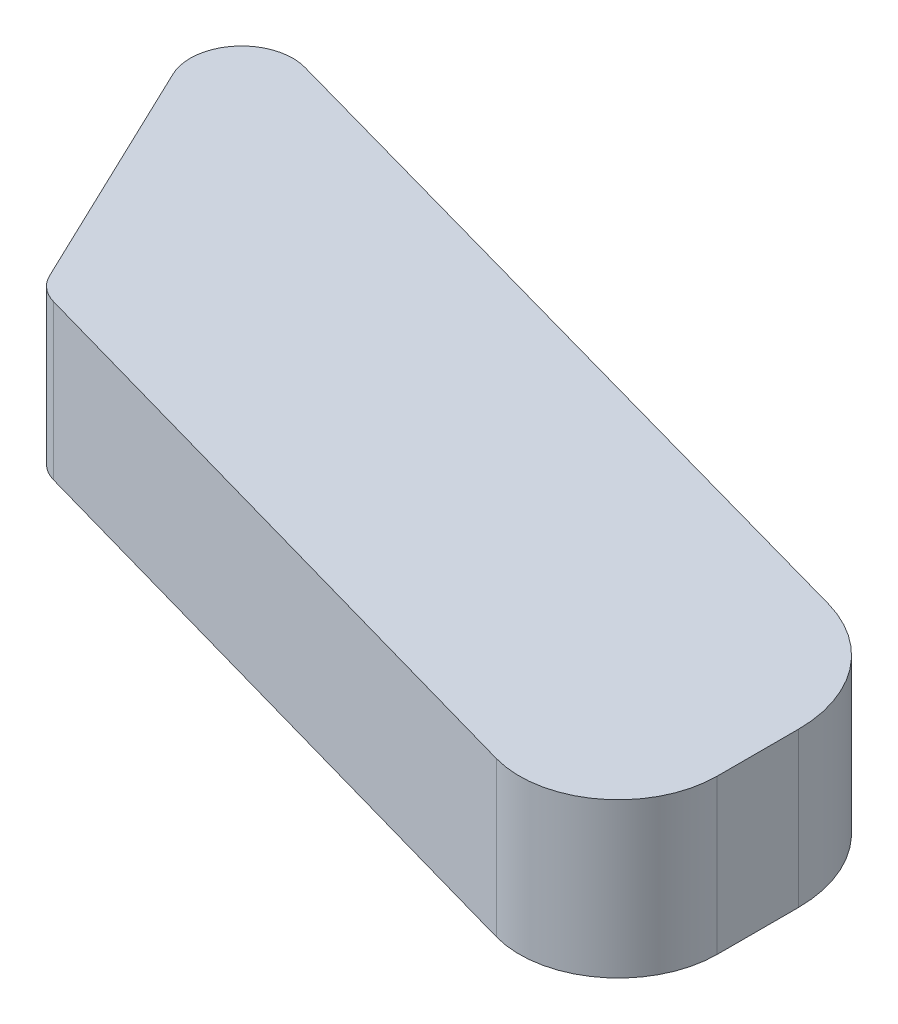
ISO-10303-21;
HEADER;
FILE_DESCRIPTION(('STEP AP214'),'2;1');
FILE_NAME('part.step','',(''),(''),'','','');
FILE_SCHEMA(('AUTOMOTIVE_DESIGN { 1 0 10303 214 1 1 1 1 }'));
ENDSEC;
DATA;
#1=APPLICATION_CONTEXT('core data for automotive mechanical design processes');
#2=APPLICATION_PROTOCOL_DEFINITION('international standard','automotive_design',2000,#1);
#3=PRODUCT_CONTEXT('',#1,'mechanical');
#4=PRODUCT('Part','Part','',(#3));
#5=PRODUCT_RELATED_PRODUCT_CATEGORY('part','',(#4));
#6=PRODUCT_DEFINITION_FORMATION('','',#4);
#7=PRODUCT_DEFINITION_CONTEXT('part definition',#1,'design');
#8=PRODUCT_DEFINITION('design','',#6,#7);
#9=PRODUCT_DEFINITION_SHAPE('','',#8);
#10=(LENGTH_UNIT() NAMED_UNIT(*) SI_UNIT(.MILLI.,.METRE.));
#11=(NAMED_UNIT(*) PLANE_ANGLE_UNIT() SI_UNIT($,.RADIAN.));
#12=(NAMED_UNIT(*) SI_UNIT($,.STERADIAN.) SOLID_ANGLE_UNIT());
#13=UNCERTAINTY_MEASURE_WITH_UNIT(LENGTH_MEASURE(1.E-05),#10,'distance_accuracy_value','');
#14=(GEOMETRIC_REPRESENTATION_CONTEXT(3) GLOBAL_UNCERTAINTY_ASSIGNED_CONTEXT((#13)) GLOBAL_UNIT_ASSIGNED_CONTEXT((#10,
#11,#12)) REPRESENTATION_CONTEXT('',''));
#15=CARTESIAN_POINT('',(0.,0.,0.));
#16=DIRECTION('',(0.,0.,1.));
#17=DIRECTION('',(1.,0.,0.));
#18=AXIS2_PLACEMENT_3D('',#15,#16,#17);
#19=CARTESIAN_POINT('',(0.151021595103856,2.9956,2.9686260486294));
#20=DIRECTION('',(0.,-1.,0.));
#21=DIRECTION('',(-1.,0.,0.));
#22=AXIS2_PLACEMENT_3D('',#19,#20,#21);
#23=CYLINDRICAL_SURFACE('',#22,0.0216216216215917);
#24=CARTESIAN_POINT('',(0.151021595103856,2.9956,2.9686260486294));
#25=DIRECTION('',(0.,1.,0.));
#26=DIRECTION('',(1.,0.,0.));
#27=AXIS2_PLACEMENT_3D('',#24,#25,#26);
#28=CIRCLE('',#27,0.0216216216215917);
#29=CARTESIAN_POINT('',(0.129399973482265,2.9956,2.9686260486294));
#30=VERTEX_POINT('',#29);
#31=CARTESIAN_POINT('',(0.131512238873626,2.9956,2.9779469681671));
#32=VERTEX_POINT('',#31);
#33=EDGE_CURVE('E11',#30,#32,#28,.T.);
#34=ORIENTED_EDGE('',*,*,#33,.F.);
#35=DIRECTION('',(0.,-1.,0.));
#36=VECTOR('',#35,1.);
#37=CARTESIAN_POINT('',(0.129399973482265,2.9956,2.9686260486294));
#38=LINE('',#37,#36);
#39=CARTESIAN_POINT('',(0.129399973482265,2.9306,2.9686260486294));
#40=VERTEX_POINT('',#39);
#41=EDGE_CURVE('E24',#30,#40,#38,.T.);
#42=ORIENTED_EDGE('',*,*,#41,.T.);
#43=CARTESIAN_POINT('',(0.151021595103856,2.9306,2.9686260486294));
#44=DIRECTION('',(0.,1.,0.));
#45=DIRECTION('',(1.,0.,0.));
#46=AXIS2_PLACEMENT_3D('',#43,#44,#45);
#47=CIRCLE('',#46,0.0216216216215917);
#48=CARTESIAN_POINT('',(0.131512238873626,2.9306,2.9779469681671));
#49=VERTEX_POINT('',#48);
#50=EDGE_CURVE('E157',#40,#49,#47,.T.);
#51=ORIENTED_EDGE('',*,*,#50,.T.);
#52=DIRECTION('',(0.,-1.,0.));
#53=VECTOR('',#52,1.);
#54=CARTESIAN_POINT('',(0.131512238873626,2.9956,2.9779469681671));
#55=LINE('',#54,#53);
#56=EDGE_CURVE('E154',#32,#49,#55,.T.);
#57=ORIENTED_EDGE('',*,*,#56,.F.);
#58=EDGE_LOOP('',(#34,#42,#51,#57));
#59=FACE_BOUND('',#58,.T.);
#60=ADVANCED_FACE('F17',(#59),#23,.T.);
#61=CARTESIAN_POINT('',(0.460422838557316,2.9956,3.1194344723795));
#62=DIRECTION('',(0.,-1.,0.));
#63=DIRECTION('',(-1.,0.,0.));
#64=AXIS2_PLACEMENT_3D('',#61,#62,#63);
#65=CYLINDRICAL_SURFACE('',#64,0.041621621621607);
#66=CARTESIAN_POINT('',(0.460422838557316,2.9306,3.1194344723795));
#67=DIRECTION('',(0.,1.,0.));
#68=DIRECTION('',(1.,0.,0.));
#69=AXIS2_PLACEMENT_3D('',#66,#67,#68);
#70=CIRCLE('',#69,0.041621621621607);
#71=CARTESIAN_POINT('',(0.449110063696537,2.9306,3.1594891913445));
#72=VERTEX_POINT('',#71);
#73=CARTESIAN_POINT('',(0.502044460110766,2.9306,3.1194320904308));
#74=VERTEX_POINT('',#73);
#75=EDGE_CURVE('E152',#72,#74,#70,.T.);
#76=ORIENTED_EDGE('',*,*,#75,.T.);
#77=DIRECTION('',(0.,-1.,0.));
#78=VECTOR('',#77,1.);
#79=CARTESIAN_POINT('',(0.502044460110766,2.9956,3.1194320904308));
#80=LINE('',#79,#78);
#81=CARTESIAN_POINT('',(0.502044460110766,2.9956,3.1194320904308));
#82=VERTEX_POINT('',#81);
#83=EDGE_CURVE('E149',#82,#74,#80,.T.);
#84=ORIENTED_EDGE('',*,*,#83,.F.);
#85=CARTESIAN_POINT('',(0.460422838557316,2.9956,3.1194344723795));
#86=DIRECTION('',(0.,1.,0.));
#87=DIRECTION('',(1.,0.,0.));
#88=AXIS2_PLACEMENT_3D('',#85,#86,#87);
#89=CIRCLE('',#88,0.041621621621607);
#90=CARTESIAN_POINT('',(0.449110063696537,2.9956,3.1594891913445));
#91=VERTEX_POINT('',#90);
#92=EDGE_CURVE('E147',#91,#82,#89,.T.);
#93=ORIENTED_EDGE('',*,*,#92,.F.);
#94=DIRECTION('',(0.,-1.,0.));
#95=VECTOR('',#94,1.);
#96=CARTESIAN_POINT('',(0.449110063696537,2.9956,3.1594891913445));
#97=LINE('',#96,#95);
#98=EDGE_CURVE('E107',#91,#72,#97,.T.);
#99=ORIENTED_EDGE('',*,*,#98,.T.);
#100=EDGE_LOOP('',(#76,#84,#93,#99));
#101=FACE_BOUND('',#100,.T.);
#102=ADVANCED_FACE('F179',(#101),#65,.T.);
#103=CARTESIAN_POINT('',(0.502044460110766,2.9956,3.1194320904308));
#104=DIRECTION('',(-0.999999998362442,0.,5.72286373709856E-05));
#105=DIRECTION('',(5.72286373709856E-05,0.,0.999999998362442));
#106=AXIS2_PLACEMENT_3D('',#103,#104,#105);
#107=PLANE('',#106);
#108=DIRECTION('',(-5.72286373709856E-05,0.,-0.999999998362441));
#109=VECTOR('',#108,1.);
#110=CARTESIAN_POINT('',(0.502044460110766,2.9306,3.1194320904308));
#111=LINE('',#110,#109);
#112=CARTESIAN_POINT('',(0.502042503467266,2.9306,3.085242153597));
#113=VERTEX_POINT('',#112);
#114=EDGE_CURVE('E144',#74,#113,#111,.T.);
#115=ORIENTED_EDGE('',*,*,#114,.T.);
#116=DIRECTION('',(0.,-1.,0.));
#117=VECTOR('',#116,1.);
#118=CARTESIAN_POINT('',(0.502042503467266,2.9956,3.085242153597));
#119=LINE('',#118,#117);
#120=CARTESIAN_POINT('',(0.502042503467266,2.9956,3.085242153597));
#121=VERTEX_POINT('',#120);
#122=EDGE_CURVE('E141',#121,#113,#119,.T.);
#123=ORIENTED_EDGE('',*,*,#122,.F.);
#124=DIRECTION('',(-5.72286373709856E-05,0.,-0.999999998362441));
#125=VECTOR('',#124,1.);
#126=CARTESIAN_POINT('',(0.502044460110766,2.9956,3.1194320904308));
#127=LINE('',#126,#125);
#128=EDGE_CURVE('E138',#82,#121,#127,.T.);
#129=ORIENTED_EDGE('',*,*,#128,.F.);
#130=ORIENTED_EDGE('',*,*,#83,.T.);
#131=EDGE_LOOP('',(#115,#123,#129,#130));
#132=FACE_BOUND('',#131,.T.);
#133=ADVANCED_FACE('F177',(#132),#107,.F.);
#134=CARTESIAN_POINT('',(0.447988449501714,2.9956,3.085245247037));
#135=DIRECTION('',(0.,-1.,0.));
#136=DIRECTION('',(-1.,0.,0.));
#137=AXIS2_PLACEMENT_3D('',#134,#135,#136);
#138=CYLINDRICAL_SURFACE('',#137,0.0540540540540688);
#139=CARTESIAN_POINT('',(0.447988449501714,2.9306,3.085245247037));
#140=DIRECTION('',(0.,1.,0.));
#141=DIRECTION('',(1.,0.,0.));
#142=AXIS2_PLACEMENT_3D('',#139,#140,#141);
#143=CIRCLE('',#142,0.0540540540540688);
#144=CARTESIAN_POINT('',(0.462529665695283,2.9306,3.0331838045743));
#145=VERTEX_POINT('',#144);
#146=EDGE_CURVE('E136',#113,#145,#143,.T.);
#147=ORIENTED_EDGE('',*,*,#146,.T.);
#148=DIRECTION('',(0.,-1.,0.));
#149=VECTOR('',#148,1.);
#150=CARTESIAN_POINT('',(0.462529665695283,2.9956,3.0331838045743));
#151=LINE('',#150,#149);
#152=CARTESIAN_POINT('',(0.462529665695283,2.9956,3.0331838045743));
#153=VERTEX_POINT('',#152);
#154=EDGE_CURVE('E133',#153,#145,#151,.T.);
#155=ORIENTED_EDGE('',*,*,#154,.F.);
#156=CARTESIAN_POINT('',(0.447988449501714,2.9956,3.085245247037));
#157=DIRECTION('',(0.,1.,0.));
#158=DIRECTION('',(1.,0.,0.));
#159=AXIS2_PLACEMENT_3D('',#156,#157,#158);
#160=CIRCLE('',#159,0.0540540540540688);
#161=EDGE_CURVE('E130',#121,#153,#160,.T.);
#162=ORIENTED_EDGE('',*,*,#161,.F.);
#163=ORIENTED_EDGE('',*,*,#122,.T.);
#164=EDGE_LOOP('',(#147,#155,#162,#163));
#165=FACE_BOUND('',#164,.T.);
#166=ADVANCED_FACE('F173',(#165),#138,.T.);
#167=CARTESIAN_POINT('',(0.462529665695283,2.9956,3.0331838045743));
#168=DIRECTION('',(-0.26901249958118,0.,0.963136685558745));
#169=DIRECTION('',(0.963136685558745,0.,0.26901249958118));
#170=AXIS2_PLACEMENT_3D('',#167,#168,#169);
#171=PLANE('',#170);
#172=DIRECTION('',(-0.963136685558745,0.,-0.26901249958118));
#173=VECTOR('',#172,1.);
#174=CARTESIAN_POINT('',(0.462529665695283,2.9306,3.0331838045743));
#175=LINE('',#174,#173);
#176=CARTESIAN_POINT('',(0.156838081581269,2.9306,2.9478014716443));
#177=VERTEX_POINT('',#176);
#178=EDGE_CURVE('E128',#145,#177,#175,.T.);
#179=ORIENTED_EDGE('',*,*,#178,.T.);
#180=DIRECTION('',(0.,-1.,0.));
#181=VECTOR('',#180,1.);
#182=CARTESIAN_POINT('',(0.156838081581269,2.9956,2.9478014716443));
#183=LINE('',#182,#181);
#184=CARTESIAN_POINT('',(0.156838081581269,2.9956,2.9478014716443));
#185=VERTEX_POINT('',#184);
#186=EDGE_CURVE('E125',#185,#177,#183,.T.);
#187=ORIENTED_EDGE('',*,*,#186,.F.);
#188=DIRECTION('',(-0.963136685558745,0.,-0.26901249958118));
#189=VECTOR('',#188,1.);
#190=CARTESIAN_POINT('',(0.462529665695283,2.9956,3.0331838045743));
#191=LINE('',#190,#189);
#192=EDGE_CURVE('E122',#153,#185,#191,.T.);
#193=ORIENTED_EDGE('',*,*,#192,.F.);
#194=ORIENTED_EDGE('',*,*,#154,.T.);
#195=EDGE_LOOP('',(#179,#187,#193,#194));
#196=FACE_BOUND('',#195,.T.);
#197=ADVANCED_FACE('F169',(#196),#171,.F.);
#198=CARTESIAN_POINT('',(0.151021595103856,2.9956,2.9686260486294));
#199=DIRECTION('',(0.,-1.,0.));
#200=DIRECTION('',(-1.,0.,0.));
#201=AXIS2_PLACEMENT_3D('',#198,#199,#200);
#202=CYLINDRICAL_SURFACE('',#201,0.0216216216215917);
#203=ORIENTED_EDGE('',*,*,#41,.F.);
#204=CARTESIAN_POINT('',(0.151021595103856,2.9956,2.9686260486294));
#205=DIRECTION('',(0.,1.,0.));
#206=DIRECTION('',(1.,0.,0.));
#207=AXIS2_PLACEMENT_3D('',#204,#205,#206);
#208=CIRCLE('',#207,0.0216216216215917);
#209=EDGE_CURVE('E120',#185,#30,#208,.T.);
#210=ORIENTED_EDGE('',*,*,#209,.F.);
#211=ORIENTED_EDGE('',*,*,#186,.T.);
#212=CARTESIAN_POINT('',(0.151021595103856,2.9306,2.9686260486294));
#213=DIRECTION('',(0.,1.,0.));
#214=DIRECTION('',(1.,0.,0.));
#215=AXIS2_PLACEMENT_3D('',#212,#213,#214);
#216=CIRCLE('',#215,0.0216216216215917);
#217=EDGE_CURVE('E117',#177,#40,#216,.T.);
#218=ORIENTED_EDGE('',*,*,#217,.T.);
#219=EDGE_LOOP('',(#203,#210,#211,#218));
#220=FACE_BOUND('',#219,.T.);
#221=ADVANCED_FACE('F166',(#220),#202,.T.);
#222=CARTESIAN_POINT('',(0.131512238873626,2.9956,2.9779469681671));
#223=DIRECTION('',(0.902307725649961,0.,-0.431092528620475));
#224=DIRECTION('',(-0.431092528620475,0.,-0.902307725649961));
#225=AXIS2_PLACEMENT_3D('',#222,#223,#224);
#226=PLANE('',#225);
#227=DIRECTION('',(0.431092528620475,0.,0.902307725649961));
#228=VECTOR('',#227,1.);
#229=CARTESIAN_POINT('',(0.131512238873626,2.9306,2.9779469681671));
#230=LINE('',#229,#228);
#231=CARTESIAN_POINT('',(0.179072678177959,2.9306,3.0774943946951));
#232=VERTEX_POINT('',#231);
#233=EDGE_CURVE('E115',#49,#232,#230,.T.);
#234=ORIENTED_EDGE('',*,*,#233,.T.);
#235=DIRECTION('',(0.,-1.,0.));
#236=VECTOR('',#235,1.);
#237=CARTESIAN_POINT('',(0.179072678177959,2.9956,3.0774943946951));
#238=LINE('',#237,#236);
#239=CARTESIAN_POINT('',(0.179072678177959,2.9956,3.0774943946951));
#240=VERTEX_POINT('',#239);
#241=EDGE_CURVE('E113',#240,#232,#238,.T.);
#242=ORIENTED_EDGE('',*,*,#241,.F.);
#243=DIRECTION('',(0.431092528620475,0.,0.902307725649961));
#244=VECTOR('',#243,1.);
#245=CARTESIAN_POINT('',(0.131512238873626,2.9956,2.9779469681671));
#246=LINE('',#245,#244);
#247=EDGE_CURVE('E101',#32,#240,#246,.T.);
#248=ORIENTED_EDGE('',*,*,#247,.F.);
#249=ORIENTED_EDGE('',*,*,#56,.T.);
#250=EDGE_LOOP('',(#234,#242,#248,#249));
#251=FACE_BOUND('',#250,.T.);
#252=ADVANCED_FACE('F194',(#251),#226,.F.);
#253=CARTESIAN_POINT('',(0.193704695350638,2.9956,3.0705037050418));
#254=DIRECTION('',(0.,-1.,0.));
#255=DIRECTION('',(-1.,0.,0.));
#256=AXIS2_PLACEMENT_3D('',#253,#254,#255);
#257=CYLINDRICAL_SURFACE('',#256,0.0162162162161888);
#258=CARTESIAN_POINT('',(0.193704695350638,2.9306,3.0705037050418));
#259=DIRECTION('',(0.,1.,0.));
#260=DIRECTION('',(1.,0.,0.));
#261=AXIS2_PLACEMENT_3D('',#258,#259,#260);
#262=CIRCLE('',#261,0.0162162162161888);
#263=CARTESIAN_POINT('',(0.189297120729548,2.9306,3.0861094397035));
#264=VERTEX_POINT('',#263);
#265=EDGE_CURVE('E90',#232,#264,#262,.T.);
#266=ORIENTED_EDGE('',*,*,#265,.T.);
#267=DIRECTION('',(0.,-1.,0.));
#268=VECTOR('',#267,1.);
#269=CARTESIAN_POINT('',(0.189297120729548,2.9956,3.0861094397035));
#270=LINE('',#269,#268);
#271=CARTESIAN_POINT('',(0.189297120729548,2.9956,3.0861094397035));
#272=VERTEX_POINT('',#271);
#273=EDGE_CURVE('E84',#272,#264,#270,.T.);
#274=ORIENTED_EDGE('',*,*,#273,.F.);
#275=CARTESIAN_POINT('',(0.193704695350638,2.9956,3.0705037050418));
#276=DIRECTION('',(0.,1.,0.));
#277=DIRECTION('',(1.,0.,0.));
#278=AXIS2_PLACEMENT_3D('',#275,#276,#277);
#279=CIRCLE('',#278,0.0162162162161888);
#280=EDGE_CURVE('E88',#240,#272,#279,.T.);
#281=ORIENTED_EDGE('',*,*,#280,.F.);
#282=ORIENTED_EDGE('',*,*,#241,.T.);
#283=EDGE_LOOP('',(#266,#274,#281,#282));
#284=FACE_BOUND('',#283,.T.);
#285=ADVANCED_FACE('F86',(#284),#257,.T.);
#286=CARTESIAN_POINT('',(0.189297120729548,2.9956,3.0861094397035));
#287=DIRECTION('',(0.271800434966712,0.,-0.962353637470086));
#288=DIRECTION('',(-0.962353637470086,0.,-0.271800434966712));
#289=AXIS2_PLACEMENT_3D('',#286,#287,#288);
#290=PLANE('',#289);
#291=DIRECTION('',(0.962353637470086,0.,0.271800434966712));
#292=VECTOR('',#291,1.);
#293=CARTESIAN_POINT('',(0.189297120729548,2.9306,3.0861094397035));
#294=LINE('',#293,#292);
#295=EDGE_CURVE('E102',#264,#72,#294,.T.);
#296=ORIENTED_EDGE('',*,*,#295,.T.);
#297=ORIENTED_EDGE('',*,*,#98,.F.);
#298=DIRECTION('',(0.962353637470086,0.,0.271800434966712));
#299=VECTOR('',#298,1.);
#300=CARTESIAN_POINT('',(0.189297120729548,2.9956,3.0861094397035));
#301=LINE('',#300,#299);
#302=EDGE_CURVE('E99',#272,#91,#301,.T.);
#303=ORIENTED_EDGE('',*,*,#302,.F.);
#304=ORIENTED_EDGE('',*,*,#273,.T.);
#305=EDGE_LOOP('',(#296,#297,#303,#304));
#306=FACE_BOUND('',#305,.T.);
#307=ADVANCED_FACE('F105',(#306),#290,.F.);
#308=CARTESIAN_POINT('',(0.460422838557316,2.9956,3.1194344723795));
#309=DIRECTION('',(0.,1.,0.));
#310=DIRECTION('',(1.,0.,0.));
#311=AXIS2_PLACEMENT_3D('',#308,#309,#310);
#312=PLANE('',#311);
#313=ORIENTED_EDGE('',*,*,#92,.T.);
#314=ORIENTED_EDGE('',*,*,#128,.T.);
#315=ORIENTED_EDGE('',*,*,#161,.T.);
#316=ORIENTED_EDGE('',*,*,#192,.T.);
#317=ORIENTED_EDGE('',*,*,#209,.T.);
#318=ORIENTED_EDGE('',*,*,#33,.T.);
#319=ORIENTED_EDGE('',*,*,#247,.T.);
#320=ORIENTED_EDGE('',*,*,#280,.T.);
#321=ORIENTED_EDGE('',*,*,#302,.T.);
#322=EDGE_LOOP('',(#313,#314,#315,#316,#317,#318,#319,#320,#321));
#323=FACE_BOUND('',#322,.T.);
#324=ADVANCED_FACE('F98',(#323),#312,.T.);
#325=CARTESIAN_POINT('',(0.460422838557316,2.9306,3.1194344723795));
#326=DIRECTION('',(0.,1.,0.));
#327=DIRECTION('',(1.,0.,0.));
#328=AXIS2_PLACEMENT_3D('',#325,#326,#327);
#329=PLANE('',#328);
#330=ORIENTED_EDGE('',*,*,#75,.F.);
#331=ORIENTED_EDGE('',*,*,#295,.F.);
#332=ORIENTED_EDGE('',*,*,#265,.F.);
#333=ORIENTED_EDGE('',*,*,#233,.F.);
#334=ORIENTED_EDGE('',*,*,#50,.F.);
#335=ORIENTED_EDGE('',*,*,#217,.F.);
#336=ORIENTED_EDGE('',*,*,#178,.F.);
#337=ORIENTED_EDGE('',*,*,#146,.F.);
#338=ORIENTED_EDGE('',*,*,#114,.F.);
#339=EDGE_LOOP('',(#330,#331,#332,#333,#334,#335,#336,#337,#338));
#340=FACE_BOUND('',#339,.T.);
#341=ADVANCED_FACE('F164',(#340),#329,.F.);
#342=CLOSED_SHELL('',(#60,#102,#133,#166,#197,#221,#252,#285,#307,#324,#341));
#343=MANIFOLD_SOLID_BREP('B1',#342);
#344=ADVANCED_BREP_SHAPE_REPRESENTATION('',(#18,#343),#14);
#345=SHAPE_DEFINITION_REPRESENTATION(#9,#344);
ENDSEC;
END-ISO-10303-21;
